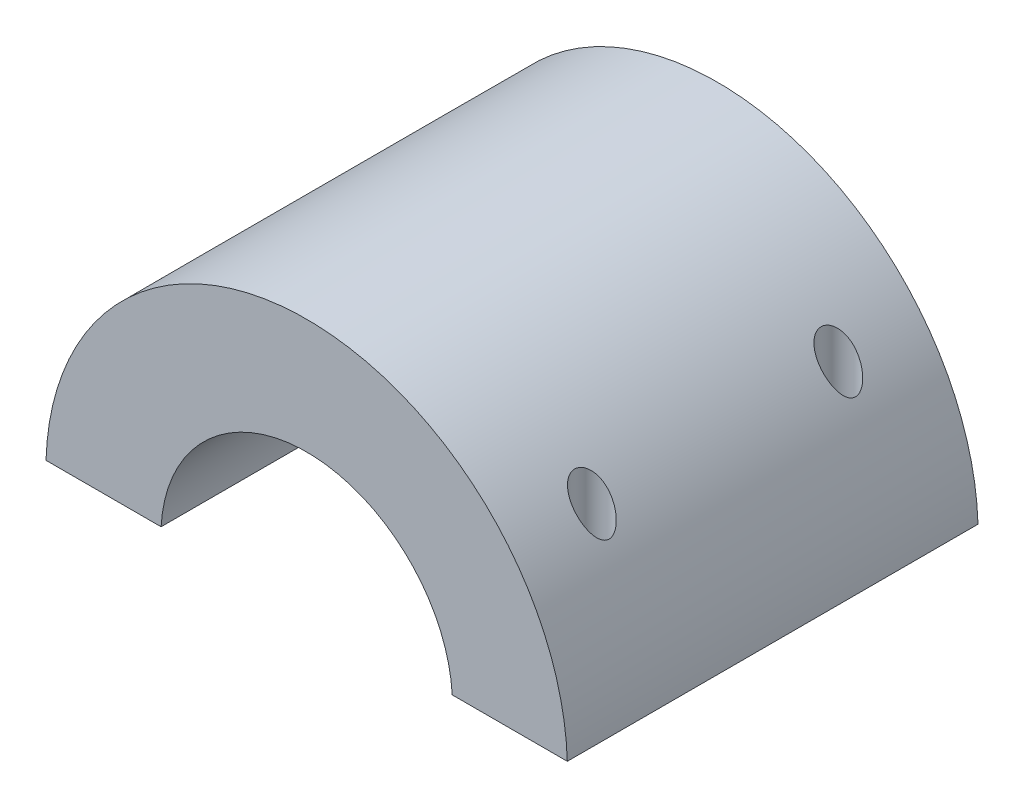
ISO-10303-21;
HEADER;
FILE_DESCRIPTION(('STEP AP214'),'2;1');
FILE_NAME('part.step','',(''),(''),'','','');
FILE_SCHEMA(('AUTOMOTIVE_DESIGN { 1 0 10303 214 1 1 1 1 }'));
ENDSEC;
DATA;
#1=APPLICATION_CONTEXT('core data for automotive mechanical design processes');
#2=APPLICATION_PROTOCOL_DEFINITION('international standard','automotive_design',2000,#1);
#3=PRODUCT_CONTEXT('',#1,'mechanical');
#4=PRODUCT('Part','Part','',(#3));
#5=PRODUCT_RELATED_PRODUCT_CATEGORY('part','',(#4));
#6=PRODUCT_DEFINITION_FORMATION('','',#4);
#7=PRODUCT_DEFINITION_CONTEXT('part definition',#1,'design');
#8=PRODUCT_DEFINITION('design','',#6,#7);
#9=PRODUCT_DEFINITION_SHAPE('','',#8);
#10=(LENGTH_UNIT() NAMED_UNIT(*) SI_UNIT(.MILLI.,.METRE.));
#11=(NAMED_UNIT(*) PLANE_ANGLE_UNIT() SI_UNIT($,.RADIAN.));
#12=(NAMED_UNIT(*) SI_UNIT($,.STERADIAN.) SOLID_ANGLE_UNIT());
#13=UNCERTAINTY_MEASURE_WITH_UNIT(LENGTH_MEASURE(1.E-05),#10,'distance_accuracy_value','');
#14=(GEOMETRIC_REPRESENTATION_CONTEXT(3) GLOBAL_UNCERTAINTY_ASSIGNED_CONTEXT((#13)) GLOBAL_UNIT_ASSIGNED_CONTEXT((#10,
#11,#12)) REPRESENTATION_CONTEXT('',''));
#15=CARTESIAN_POINT('',(0.,0.,0.));
#16=DIRECTION('',(0.,0.,1.));
#17=DIRECTION('',(1.,0.,0.));
#18=AXIS2_PLACEMENT_3D('',#15,#16,#17);
#19=CARTESIAN_POINT('',(0.,0.,50.));
#20=DIRECTION('',(0.,0.,-1.));
#21=DIRECTION('',(-1.,0.,0.));
#22=AXIS2_PLACEMENT_3D('',#19,#20,#21);
#23=CYLINDRICAL_SURFACE('',#22,31.75);
#24=CARTESIAN_POINT('',(-24.7280283297466,19.9144950958654,37.9));
#25=CARTESIAN_POINT('',(-24.6428554988149,20.0202557515295,37.9000019193602));
#26=CARTESIAN_POINT('',(-24.557008965641,20.1254602188119,37.9051723099552));
#27=CARTESIAN_POINT('',(-24.3844723968006,20.3341665965845,37.9264692281959));
#28=CARTESIAN_POINT('',(-24.2977820238086,20.4376677776256,37.9426003309251));
#29=CARTESIAN_POINT('',(-24.1244605621036,20.6419673595394,37.9866222893193));
#30=CARTESIAN_POINT('',(-24.0378295689512,20.7427694525141,38.0144961052082));
#31=CARTESIAN_POINT('',(-23.8655769347329,20.9407242274326,38.0830332029018));
#32=CARTESIAN_POINT('',(-23.7799544855246,21.037879990178,38.1236854028697));
#33=CARTESIAN_POINT('',(-23.6030507159638,21.2362368747943,38.2235700029081));
#34=CARTESIAN_POINT('',(-23.5119977842424,21.3369546688765,38.2841936646951));
#35=CARTESIAN_POINT('',(-23.335427850559,21.5299172903328,38.4241434967715));
#36=CARTESIAN_POINT('',(-23.2499033152815,21.6221737227063,38.5034435023705));
#37=CARTESIAN_POINT('',(-23.104938854677,21.776895077098,38.6640519446132));
#38=CARTESIAN_POINT('',(-23.0437481006753,21.8415880808563,38.7416070621418));
#39=CARTESIAN_POINT('',(-22.9302085850994,21.9607555403227,38.9099935111327));
#40=CARTESIAN_POINT('',(-22.8778479577153,22.0152437202112,39.0008067151943));
#41=CARTESIAN_POINT('',(-22.7952391219599,22.1007318385835,39.1744588480943));
#42=CARTESIAN_POINT('',(-22.7626563394566,22.1342620171961,39.2549316442756));
#43=CARTESIAN_POINT('',(-22.7070676415742,22.1912859329778,39.4225133285041));
#44=CARTESIAN_POINT('',(-22.6840555481272,22.2147861449453,39.5096178925122));
#45=CARTESIAN_POINT('',(-22.6491761242215,22.2503474585535,39.6889369469299));
#46=CARTESIAN_POINT('',(-22.6373796882606,22.2623357980016,39.781180091649));
#47=CARTESIAN_POINT('',(-22.6262218976126,22.2736762761457,39.9671843295311));
#48=CARTESIAN_POINT('',(-22.6268558571594,22.273033176393,40.0609448373916));
#49=CARTESIAN_POINT('',(-22.6397826602446,22.2598921942833,40.2371502586409));
#50=CARTESIAN_POINT('',(-22.6508882404772,22.2486015087383,40.3197794875201));
#51=CARTESIAN_POINT('',(-22.6822830231849,22.2165936802652,40.4813547170553));
#52=CARTESIAN_POINT('',(-22.7025731787321,22.1958755590628,40.5603003345294));
#53=CARTESIAN_POINT('',(-22.7520393018955,22.1451686891129,40.7158086867132));
#54=CARTESIAN_POINT('',(-22.7815249866583,22.1148561531806,40.7921653239098));
#55=CARTESIAN_POINT('',(-22.8475127996441,22.0466758708029,40.9381313435327));
#56=CARTESIAN_POINT('',(-22.8840186265449,22.0088041412707,41.0077371399558));
#57=CARTESIAN_POINT('',(-22.9832647784215,21.9052387081702,41.1745411139535));
#58=CARTESIAN_POINT('',(-23.0496992365125,21.835393710958,41.2669761678225));
#59=CARTESIAN_POINT('',(-23.1911058420834,21.6851525408156,41.4352742845386));
#60=CARTESIAN_POINT('',(-23.266098344869,21.6047311397013,41.5110965295361));
#61=CARTESIAN_POINT('',(-23.4553236981815,21.3994678020596,41.6769779128811));
#62=CARTESIAN_POINT('',(-23.5723792466759,21.2705761092943,41.7587707849483));
#63=CARTESIAN_POINT('',(-23.8111791497816,21.0029190650672,41.8942760331488));
#64=CARTESIAN_POINT('',(-23.9329304282464,20.8641388561027,41.9479450976505));
#65=CARTESIAN_POINT('',(-24.1422836071243,20.6211189870472,42.0187486850744));
#66=CARTESIAN_POINT('',(-24.2296708433654,20.5183809668015,42.0419458613788));
#67=CARTESIAN_POINT('',(-24.4041000502553,20.3106078604613,42.0767731292156));
#68=CARTESIAN_POINT('',(-24.4911418568187,20.2055718084444,42.0883982574038));
#69=CARTESIAN_POINT('',(-24.6643158750043,19.9938184267603,42.1008308256512));
#70=CARTESIAN_POINT('',(-24.7504460708589,19.8870983095189,42.1016179041554));
#71=CARTESIAN_POINT('',(-24.921091699947,19.6728351520505,42.0928508215475));
#72=CARTESIAN_POINT('',(-25.0056073924316,19.5652922478946,42.0832983351743));
#73=CARTESIAN_POINT('',(-25.1747836870916,19.3471525975669,42.053771239076));
#74=CARTESIAN_POINT('',(-25.2593898625408,19.236549788208,42.0335296447154));
#75=CARTESIAN_POINT('',(-25.4260159324306,19.0157656894158,41.9825257215204));
#76=CARTESIAN_POINT('',(-25.5080350949676,18.9055845268835,41.9517604440306));
#77=CARTESIAN_POINT('',(-25.6687564916281,18.6867817601804,41.8795671788701));
#78=CARTESIAN_POINT('',(-25.7474672489248,18.5781566931903,41.8381688290725));
#79=CARTESIAN_POINT('',(-25.9011673379522,18.3632637633046,41.7440933108115));
#80=CARTESIAN_POINT('',(-25.976159301034,18.2569942639688,41.6914242617087));
#81=CARTESIAN_POINT('',(-26.1205170834076,18.0498413692962,41.5746328904914));
#82=CARTESIAN_POINT('',(-26.1899520860279,17.9489000238142,41.5107007277078));
#83=CARTESIAN_POINT('',(-26.3232470552563,17.7528354518744,41.3692089690415));
#84=CARTESIAN_POINT('',(-26.3871072257952,17.6577120126321,41.2916498719535));
#85=CARTESIAN_POINT('',(-26.4965800965095,17.4929062465643,41.1356285204378));
#86=CARTESIAN_POINT('',(-26.5434316012945,17.4216825530964,41.0596912292399));
#87=CARTESIAN_POINT('',(-26.6297303554376,17.2894806044257,40.8955909389648));
#88=CARTESIAN_POINT('',(-26.6691957503534,17.2284772804401,40.8074588517448));
#89=CARTESIAN_POINT('',(-26.7254441194643,17.1410279776693,40.6515895516091));
#90=CARTESIAN_POINT('',(-26.7453229032444,17.1099738728752,40.5875808479502));
#91=CARTESIAN_POINT('',(-26.7793877278283,17.056608512029,40.4545587231015));
#92=CARTESIAN_POINT('',(-26.7935796384358,17.0342882417618,40.3855505495525));
#93=CARTESIAN_POINT('',(-26.8151647549225,17.0002901297496,40.2430867423418));
#94=CARTESIAN_POINT('',(-26.8224873620715,16.9887228113531,40.169593020583));
#95=CARTESIAN_POINT('',(-26.8292265068125,16.9780786117845,40.0213535704679));
#96=CARTESIAN_POINT('',(-26.8286487705361,16.9789926841589,39.9466087881162));
#97=CARTESIAN_POINT('',(-26.8202819112474,16.9922045646084,39.808650194318));
#98=CARTESIAN_POINT('',(-26.8134580739956,17.0029785575933,39.7452203563266));
#99=CARTESIAN_POINT('',(-26.7945304503923,17.0327903681731,39.6211695141527));
#100=CARTESIAN_POINT('',(-26.7824234350479,17.0518332395376,39.560550252854));
#101=CARTESIAN_POINT('',(-26.7478767474019,17.1059926942891,39.4190821017041));
#102=CARTESIAN_POINT('',(-26.7232365969373,17.1444975600091,39.3400793172437));
#103=CARTESIAN_POINT('',(-26.6673020363706,17.2313716570841,39.1902772705965));
#104=CARTESIAN_POINT('',(-26.6359918683185,17.2797642369489,39.1194980595573));
#105=CARTESIAN_POINT('',(-26.5751520332814,17.3731477688196,38.9991348213346));
#106=CARTESIAN_POINT('',(-26.5464980496618,17.4169139638338,38.9481294516009));
#107=CARTESIAN_POINT('',(-26.4866275094666,17.5078278883985,38.8508303202345));
#108=CARTESIAN_POINT('',(-26.4554093763629,17.5549776960275,38.8045394970385));
#109=CARTESIAN_POINT('',(-26.358512223855,17.7004192153919,38.6720134459615));
#110=CARTESIAN_POINT('',(-26.2896778062773,17.8025682705054,38.5922888794203));
#111=CARTESIAN_POINT('',(-26.1569668453881,17.9968703332075,38.4587064421331));
#112=CARTESIAN_POINT('',(-26.0939130150052,18.0882011951606,38.4027602912448));
#113=CARTESIAN_POINT('',(-25.9642825507963,18.2737882226707,38.3004423051816));
#114=CARTESIAN_POINT('',(-25.8977034806031,18.368046392248,38.2540772030984));
#115=CARTESIAN_POINT('',(-25.7616671805023,18.5583591042927,38.1702539907356));
#116=CARTESIAN_POINT('',(-25.6922105406027,18.6544132763189,38.1327940650761));
#117=CARTESIAN_POINT('',(-25.5508534500781,18.847565242713,38.066336981402));
#118=CARTESIAN_POINT('',(-25.4789538501433,18.9446626659064,38.0373369105332));
#119=CARTESIAN_POINT('',(-25.2970797456518,19.1873183025787,37.9752941595375));
#120=CARTESIAN_POINT('',(-25.1857869306761,19.3332006822458,37.9472900609486));
#121=CARTESIAN_POINT('',(-24.9594260049616,19.6245664464409,37.9096357632991));
#122=CARTESIAN_POINT('',(-24.8443555124835,19.7700495140617,37.8999973785799));
#123=CARTESIAN_POINT('',(-24.7280283297466,19.9144950958654,37.9));
#124=B_SPLINE_CURVE_WITH_KNOTS('',3,(#24,#25,#26,#27,#28,#29,#30,#31,#32,#33,#34,#35,#36,#37,
#38,#39,#40,#41,#42,#43,#44,#45,#46,#47,#48,#49,#50,#51,#52,#53,#54,#55,#56,#57,#58,#59,#60,#61,
#62,#63,#64,#65,#66,#67,#68,#69,#70,#71,#72,#73,#74,#75,#76,#77,#78,#79,#80,#81,#82,#83,#84,#85,
#86,#87,#88,#89,#90,#91,#92,#93,#94,#95,#96,#97,#98,#99,#100,#101,#102,#103,#104,#105,#106,#107,
#108,#109,#110,#111,#112,#113,#114,#115,#116,#117,#118,#119,#120,#121,#122,#123),.UNSPECIFIED.,
.T.,.F.,(4,2,2,2,2,2,2,2,2,2,2,2,2,2,2,2,2,2,2,2,2,2,2,2,2,2,2,2,2,2,2,2,2,2,2,2,2,2,2,2,2,2,2,
2,2,2,2,2,2,4),(0.,0.407246596628123,0.814663285546323,1.22149080007744,1.62796646924283,
2.07279693971113,2.51700789194793,2.87003975606011,3.22259337357175,3.50069304336051,
3.77861291465773,4.05827806990374,4.337837804509,4.58908494807764,4.84035816923152,
5.10122616829726,5.36223198841303,5.76063240652758,6.16000098661438,6.73395571959151,
7.3087917840091,7.71885919733602,8.1291024161764,8.54011625822715,8.95106353675497,
9.37279760794447,9.79464994271636,10.2153389606195,10.6357259302304,11.0495975488097,
11.463454021357,11.8050087185405,12.1457129709323,12.366590931826,12.5872403188368,
12.8101333380588,13.0328648140428,13.2260954347111,13.4194443205825,13.6917381706093,
13.9646825953362,14.1835650383086,14.4025830799051,14.8413006952128,15.2137204733246,
15.5864010863791,15.9590056607126,16.3314817898938,16.8873328028758,17.4435412645025),.UNSPECIFIED.);
#125=CARTESIAN_POINT('',(-24.7280283297466,19.9144950958654,37.9));
#126=VERTEX_POINT('',#125);
#127=EDGE_CURVE('E164',#126,#126,#124,.T.);
#128=ORIENTED_EDGE('',*,*,#127,.T.);
#129=EDGE_LOOP('',(#128));
#130=FACE_BOUND('',#129,.T.);
#131=CARTESIAN_POINT('',(-24.7280283297466,19.9144950958654,7.90000000000001));
#132=CARTESIAN_POINT('',(-24.6428554988149,20.0202557515295,7.90000191936025));
#133=CARTESIAN_POINT('',(-24.557008965641,20.1254602188119,7.90517230995521));
#134=CARTESIAN_POINT('',(-24.3844723968006,20.3341665965846,7.92646922819594));
#135=CARTESIAN_POINT('',(-24.2977820238086,20.4376677776256,7.94260033092508));
#136=CARTESIAN_POINT('',(-24.1244605621036,20.6419673595394,7.98662228931932));
#137=CARTESIAN_POINT('',(-24.0378295689512,20.7427694525141,8.01449610520817));
#138=CARTESIAN_POINT('',(-23.8655769347329,20.9407242274326,8.08303320290177));
#139=CARTESIAN_POINT('',(-23.7799544855246,21.037879990178,8.12368540286966));
#140=CARTESIAN_POINT('',(-23.6030507159638,21.2362368747944,8.22357000290813));
#141=CARTESIAN_POINT('',(-23.5119977842424,21.3369546688765,8.28419366469511));
#142=CARTESIAN_POINT('',(-23.335427850559,21.5299172903328,8.42414349677148));
#143=CARTESIAN_POINT('',(-23.2499033152815,21.6221737227063,8.50344350237054));
#144=CARTESIAN_POINT('',(-23.104938854677,21.776895077098,8.66405194461318));
#145=CARTESIAN_POINT('',(-23.0437481006753,21.8415880808563,8.74160706214181));
#146=CARTESIAN_POINT('',(-22.9302085850994,21.9607555403227,8.90999351113272));
#147=CARTESIAN_POINT('',(-22.8778479577153,22.0152437202112,9.00080671519433));
#148=CARTESIAN_POINT('',(-22.7952391219599,22.1007318385835,9.17445884809427));
#149=CARTESIAN_POINT('',(-22.7626563394566,22.1342620171961,9.25493164427563));
#150=CARTESIAN_POINT('',(-22.7070676415742,22.1912859329778,9.42251332850407));
#151=CARTESIAN_POINT('',(-22.6840555481272,22.2147861449453,9.50961789251218));
#152=CARTESIAN_POINT('',(-22.6491761242215,22.2503474585535,9.68893694692987));
#153=CARTESIAN_POINT('',(-22.6373796882606,22.2623357980016,9.78118009164905));
#154=CARTESIAN_POINT('',(-22.6262218976126,22.2736762761457,9.96718432953114));
#155=CARTESIAN_POINT('',(-22.6268558571594,22.273033176393,10.0609448373916));
#156=CARTESIAN_POINT('',(-22.6397826602446,22.2598921942833,10.2371502586409));
#157=CARTESIAN_POINT('',(-22.6508882404772,22.2486015087383,10.3197794875201));
#158=CARTESIAN_POINT('',(-22.6822830231849,22.2165936802653,10.4813547170553));
#159=CARTESIAN_POINT('',(-22.7025731787321,22.1958755590628,10.5603003345294));
#160=CARTESIAN_POINT('',(-22.7520393018955,22.1451686891129,10.7158086867132));
#161=CARTESIAN_POINT('',(-22.7815249866583,22.1148561531806,10.7921653239098));
#162=CARTESIAN_POINT('',(-22.8475127996441,22.0466758708029,10.9381313435327));
#163=CARTESIAN_POINT('',(-22.8840186265449,22.0088041412707,11.0077371399558));
#164=CARTESIAN_POINT('',(-22.9832647784215,21.9052387081702,11.1745411139535));
#165=CARTESIAN_POINT('',(-23.0496992365125,21.835393710958,11.2669761678225));
#166=CARTESIAN_POINT('',(-23.1911058420834,21.6851525408156,11.4352742845386));
#167=CARTESIAN_POINT('',(-23.266098344869,21.6047311397013,11.5110965295361));
#168=CARTESIAN_POINT('',(-23.4553236981815,21.3994678020596,11.6769779128811));
#169=CARTESIAN_POINT('',(-23.5723792466759,21.2705761092943,11.7587707849483));
#170=CARTESIAN_POINT('',(-23.8111791497816,21.0029190650672,11.8942760331488));
#171=CARTESIAN_POINT('',(-23.9329304282464,20.8641388561027,11.9479450976505));
#172=CARTESIAN_POINT('',(-24.1422836071243,20.6211189870472,12.0187486850744));
#173=CARTESIAN_POINT('',(-24.2296708433654,20.5183809668015,12.0419458613788));
#174=CARTESIAN_POINT('',(-24.4041000502553,20.3106078604613,12.0767731292156));
#175=CARTESIAN_POINT('',(-24.4911418568187,20.2055718084444,12.0883982574038));
#176=CARTESIAN_POINT('',(-24.6643158750043,19.9938184267603,12.1008308256511));
#177=CARTESIAN_POINT('',(-24.7504460708589,19.8870983095189,12.1016179041554));
#178=CARTESIAN_POINT('',(-24.921091699947,19.6728351520505,12.0928508215475));
#179=CARTESIAN_POINT('',(-25.0056073924316,19.5652922478946,12.0832983351743));
#180=CARTESIAN_POINT('',(-25.1747836870916,19.3471525975669,12.053771239076));
#181=CARTESIAN_POINT('',(-25.2593898625408,19.236549788208,12.0335296447154));
#182=CARTESIAN_POINT('',(-25.4260159324306,19.0157656894158,11.9825257215204));
#183=CARTESIAN_POINT('',(-25.5080350949676,18.9055845268835,11.9517604440306));
#184=CARTESIAN_POINT('',(-25.6687564916281,18.6867817601804,11.8795671788701));
#185=CARTESIAN_POINT('',(-25.7474672489248,18.5781566931903,11.8381688290725));
#186=CARTESIAN_POINT('',(-25.9011673379522,18.3632637633046,11.7440933108115));
#187=CARTESIAN_POINT('',(-25.9761593010339,18.2569942639688,11.6914242617087));
#188=CARTESIAN_POINT('',(-26.1205170834076,18.0498413692962,11.5746328904915));
#189=CARTESIAN_POINT('',(-26.1899520860279,17.9489000238142,11.5107007277078));
#190=CARTESIAN_POINT('',(-26.3232470552563,17.7528354518744,11.3692089690415));
#191=CARTESIAN_POINT('',(-26.3871072257952,17.6577120126321,11.2916498719535));
#192=CARTESIAN_POINT('',(-26.4965800965095,17.4929062465643,11.1356285204378));
#193=CARTESIAN_POINT('',(-26.5434316012945,17.4216825530964,11.0596912292399));
#194=CARTESIAN_POINT('',(-26.6297303554376,17.2894806044256,10.8955909389648));
#195=CARTESIAN_POINT('',(-26.6691957503534,17.2284772804401,10.8074588517448));
#196=CARTESIAN_POINT('',(-26.7254441194643,17.1410279776693,10.6515895516091));
#197=CARTESIAN_POINT('',(-26.7453229032444,17.1099738728752,10.5875808479502));
#198=CARTESIAN_POINT('',(-26.7793877278283,17.056608512029,10.4545587231015));
#199=CARTESIAN_POINT('',(-26.7935796384358,17.0342882417618,10.3855505495525));
#200=CARTESIAN_POINT('',(-26.8151647549225,17.0002901297496,10.2430867423418));
#201=CARTESIAN_POINT('',(-26.8224873620715,16.9887228113531,10.169593020583));
#202=CARTESIAN_POINT('',(-26.8292265068125,16.9780786117845,10.0213535704679));
#203=CARTESIAN_POINT('',(-26.8286487705361,16.9789926841589,9.94660878811616));
#204=CARTESIAN_POINT('',(-26.8202819112474,16.9922045646084,9.808650194318));
#205=CARTESIAN_POINT('',(-26.8134580739956,17.0029785575933,9.74522035632665));
#206=CARTESIAN_POINT('',(-26.7945304503923,17.0327903681731,9.62116951415267));
#207=CARTESIAN_POINT('',(-26.7824234350479,17.0518332395376,9.56055025285404));
#208=CARTESIAN_POINT('',(-26.7478767474019,17.1059926942891,9.41908210170408));
#209=CARTESIAN_POINT('',(-26.7232365969373,17.1444975600091,9.34007931724373));
#210=CARTESIAN_POINT('',(-26.6673020363706,17.2313716570841,9.19027727059649));
#211=CARTESIAN_POINT('',(-26.6359918683185,17.2797642369489,9.11949805955727));
#212=CARTESIAN_POINT('',(-26.5751520332814,17.3731477688196,8.99913482133456));
#213=CARTESIAN_POINT('',(-26.5464980496618,17.4169139638338,8.94812945160093));
#214=CARTESIAN_POINT('',(-26.4866275094666,17.5078278883985,8.85083032023448));
#215=CARTESIAN_POINT('',(-26.4554093763629,17.5549776960275,8.80453949703847));
#216=CARTESIAN_POINT('',(-26.358512223855,17.7004192153919,8.67201344596154));
#217=CARTESIAN_POINT('',(-26.2896778062773,17.8025682705054,8.5922888794203));
#218=CARTESIAN_POINT('',(-26.1569668453881,17.9968703332074,8.45870644213312));
#219=CARTESIAN_POINT('',(-26.0939130150052,18.0882011951606,8.4027602912448));
#220=CARTESIAN_POINT('',(-25.9642825507963,18.2737882226707,8.30044230518158));
#221=CARTESIAN_POINT('',(-25.8977034806031,18.3680463922479,8.25407720309838));
#222=CARTESIAN_POINT('',(-25.7616671805023,18.5583591042926,8.17025399073564));
#223=CARTESIAN_POINT('',(-25.6922105406027,18.6544132763189,8.13279406507607));
#224=CARTESIAN_POINT('',(-25.5508534500781,18.847565242713,8.06633698140199));
#225=CARTESIAN_POINT('',(-25.4789538501434,18.9446626659064,8.03733691053318));
#226=CARTESIAN_POINT('',(-25.2970797456518,19.1873183025787,7.9752941595375));
#227=CARTESIAN_POINT('',(-25.1857869306761,19.3332006822458,7.94729006094856));
#228=CARTESIAN_POINT('',(-24.9594260049616,19.6245664464409,7.90963576329909));
#229=CARTESIAN_POINT('',(-24.8443555124835,19.7700495140617,7.89999737857992));
#230=CARTESIAN_POINT('',(-24.7280283297466,19.9144950958654,7.90000000000001));
#231=B_SPLINE_CURVE_WITH_KNOTS('',3,(#131,#132,#133,#134,#135,#136,#137,#138,#139,#140,#141,
#142,#143,#144,#145,#146,#147,#148,#149,#150,#151,#152,#153,#154,#155,#156,#157,#158,#159,#160,
#161,#162,#163,#164,#165,#166,#167,#168,#169,#170,#171,#172,#173,#174,#175,#176,#177,#178,#179,
#180,#181,#182,#183,#184,#185,#186,#187,#188,#189,#190,#191,#192,#193,#194,#195,#196,#197,#198,
#199,#200,#201,#202,#203,#204,#205,#206,#207,#208,#209,#210,#211,#212,#213,#214,#215,#216,#217,
#218,#219,#220,#221,#222,#223,#224,#225,#226,#227,#228,#229,#230),.UNSPECIFIED.,.T.,.F.,(4,2,2,
2,2,2,2,2,2,2,2,2,2,2,2,2,2,2,2,2,2,2,2,2,2,2,2,2,2,2,2,2,2,2,2,2,2,2,2,2,2,2,2,2,2,2,2,2,2,4),
(0.,0.407246596628126,0.814663285546325,1.22149080007745,1.62796646924283,2.07279693971112,
2.51700789194792,2.87003975606011,3.22259337357175,3.50069304336051,3.77861291465773,
4.05827806990376,4.33783780450901,4.58908494807764,4.84035816923153,5.10122616829727,
5.36223198841304,5.76063240652758,6.16000098661437,6.73395571959151,7.3087917840091,
7.71885919733602,8.1291024161764,8.54011625822714,8.95106353675497,9.37279760794446,
9.79464994271635,10.2153389606195,10.6357259302304,11.0495975488097,11.463454021357,
11.8050087185406,12.1457129709323,12.366590931826,12.5872403188368,12.8101333380588,
13.0328648140428,13.2260954347111,13.4194443205825,13.6917381706093,13.9646825953362,
14.1835650383086,14.4025830799051,14.8413006952128,15.2137204733246,15.5864010863791,
15.9590056607126,16.3314817898938,16.8873328028758,17.4435412645026),.UNSPECIFIED.);
#232=CARTESIAN_POINT('',(-24.7280283297466,19.9144950958654,7.90000000000001));
#233=VERTEX_POINT('',#232);
#234=EDGE_CURVE('E145',#233,#233,#231,.T.);
#235=ORIENTED_EDGE('',*,*,#234,.T.);
#236=EDGE_LOOP('',(#235));
#237=FACE_BOUND('',#236,.T.);
#238=CARTESIAN_POINT('',(24.7280283297466,19.9144950958654,37.9));
#239=CARTESIAN_POINT('',(24.8238481285202,19.7955156519236,37.9000020966215));
#240=CARTESIAN_POINT('',(24.9187864613373,19.6758673592113,37.90654289352));
#241=CARTESIAN_POINT('',(25.1063356494559,19.4359870815876,37.9321875265085));
#242=CARTESIAN_POINT('',(25.1989452368265,19.3157548194812,37.9512980589821));
#243=CARTESIAN_POINT('',(25.3812275979881,19.0755998843801,38.0019300390078));
#244=CARTESIAN_POINT('',(25.4708993692297,18.9556773296747,38.0334556764809));
#245=CARTESIAN_POINT('',(25.6465939428124,18.7172821701762,38.1091322043946));
#246=CARTESIAN_POINT('',(25.7326190105552,18.5988086987254,38.1532751207413));
#247=CARTESIAN_POINT('',(25.9141742396761,18.3451931893672,38.2632989437302));
#248=CARTESIAN_POINT('',(26.0089474549925,18.2105064018919,38.3315584077479));
#249=CARTESIAN_POINT('',(26.14525210073,18.0137363176988,38.449175863811));
#250=CARTESIAN_POINT('',(26.1896902719248,17.9490541351349,38.490894960391));
#251=CARTESIAN_POINT('',(26.2762896393842,17.8220368736102,38.5798795415026));
#252=CARTESIAN_POINT('',(26.3184516274389,17.7597009807869,38.6271430789615));
#253=CARTESIAN_POINT('',(26.4137150247483,17.6178228001425,38.7446287363201));
#254=CARTESIAN_POINT('',(26.4657522354873,17.5395081500462,38.8172392008564));
#255=CARTESIAN_POINT('',(26.5631652523676,17.3916228107032,38.9748963226272));
#256=CARTESIAN_POINT('',(26.6085514185156,17.3220385474148,39.0599232178469));
#257=CARTESIAN_POINT('',(26.67691442877,17.2164856764859,39.2147830055472));
#258=CARTESIAN_POINT('',(26.7024442588824,17.1768367809802,39.280949684006));
#259=CARTESIAN_POINT('',(26.74758862232,17.1064533908265,39.4197605070659));
#260=CARTESIAN_POINT('',(26.7672126965525,17.0757045210535,39.4923939556934));
#261=CARTESIAN_POINT('',(26.7960624321005,17.0303885097551,39.6295682476036));
#262=CARTESIAN_POINT('',(26.8065252488433,17.0139029867742,39.6932055802882));
#263=CARTESIAN_POINT('',(26.8215583127947,16.990194613202,39.8228610051128));
#264=CARTESIAN_POINT('',(26.8261337036509,16.9829636772163,39.8888769672071));
#265=CARTESIAN_POINT('',(26.8289679227178,16.9784860779909,40.0215608619936));
#266=CARTESIAN_POINT('',(26.8272107882977,16.9812646460713,40.0882300192211));
#267=CARTESIAN_POINT('',(26.8175216775546,16.9965616357497,40.2199825778589));
#268=CARTESIAN_POINT('',(26.8095854270509,17.0090867992005,40.2850648494485));
#269=CARTESIAN_POINT('',(26.7860859899964,17.0460746029359,40.4246924654151));
#270=CARTESIAN_POINT('',(26.7693149344626,17.0724236259294,40.4985273872943));
#271=CARTESIAN_POINT('',(26.7294439710075,17.1347802290189,40.6401379030745));
#272=CARTESIAN_POINT('',(26.7063326102656,17.1708052849426,40.7079022346631));
#273=CARTESIAN_POINT('',(26.642336216677,17.2700144795792,40.8696946041683));
#274=CARTESIAN_POINT('',(26.5983708990682,17.3377242715365,40.9596932787796));
#275=CARTESIAN_POINT('',(26.5029336455195,17.4832673267508,41.1264917552946));
#276=CARTESIAN_POINT('',(26.4514436641448,17.5611248761252,41.2032588328937));
#277=CARTESIAN_POINT('',(26.3509002615777,17.7115652052904,41.3349557599344));
#278=CARTESIAN_POINT('',(26.3025643793986,17.7832921188352,41.3914383123538));
#279=CARTESIAN_POINT('',(26.2027259514611,17.9300735484285,41.4968438808927));
#280=CARTESIAN_POINT('',(26.151221259936,18.0051303094814,41.5457616939938));
#281=CARTESIAN_POINT('',(26.0455411250356,18.1576682072762,41.6367737938285));
#282=CARTESIAN_POINT('',(25.9913613446681,18.2351532012118,41.678856491573));
#283=CARTESIAN_POINT('',(25.8807881828678,18.3917508912574,41.7566194948609));
#284=CARTESIAN_POINT('',(25.8243941980906,18.470864028183,41.7922980403851));
#285=CARTESIAN_POINT('',(25.683592724402,18.6664388044963,41.8724650832997));
#286=CARTESIAN_POINT('',(25.598111140945,18.7835199485421,41.9135787171914));
#287=CARTESIAN_POINT('',(25.4237592116958,19.0188443391826,41.983628934212));
#288=CARTESIAN_POINT('',(25.3348872730033,19.1370881121618,42.0125597146393));
#289=CARTESIAN_POINT('',(25.1543483077976,19.3737816581557,42.0583789137951));
#290=CARTESIAN_POINT('',(25.0626811732915,19.4922314389626,42.0752668666301));
#291=CARTESIAN_POINT('',(24.8771465740789,19.7284723355935,42.0967788589454));
#292=CARTESIAN_POINT('',(24.7832799120953,19.846263672863,42.1014073043468));
#293=CARTESIAN_POINT('',(24.6126277465108,20.0573098531843,42.098203556996));
#294=CARTESIAN_POINT('',(24.5361200101985,20.150827148851,42.0926464227325));
#295=CARTESIAN_POINT('',(24.3825074275094,20.3364287425242,42.0728271195654));
#296=CARTESIAN_POINT('',(24.3054027051249,20.428513326745,42.0585667128286));
#297=CARTESIAN_POINT('',(24.1512289155696,20.6105516242319,42.0207898061269));
#298=CARTESIAN_POINT('',(24.0741600073544,20.7005086675166,41.997288948022));
#299=CARTESIAN_POINT('',(23.9206513872055,20.87770773478,41.9403197524804));
#300=CARTESIAN_POINT('',(23.8442114066616,20.9649509673749,41.9068559244101));
#301=CARTESIAN_POINT('',(23.6690444612182,21.1627331629345,41.8168848699374));
#302=CARTESIAN_POINT('',(23.5708444509762,21.2719993684501,41.7564423395926));
#303=CARTESIAN_POINT('',(23.3800292481708,21.4815438658487,41.6146195700599));
#304=CARTESIAN_POINT('',(23.2874071851634,21.581833291853,41.5332657667613));
#305=CARTESIAN_POINT('',(23.1340967265171,21.7459286072033,41.3706107783884));
#306=CARTESIAN_POINT('',(23.0711935684493,21.812606483905,41.2943235421002));
#307=CARTESIAN_POINT('',(22.9539348962717,21.9359654914854,41.128223014147));
#308=CARTESIAN_POINT('',(22.899567186082,21.9926609004018,41.0384293876144));
#309=CARTESIAN_POINT('',(22.8129313459789,22.0824757614373,40.8658479617641));
#310=CARTESIAN_POINT('',(22.7784184394896,22.1180461345113,40.7854737111589));
#311=CARTESIAN_POINT('',(22.7189387575113,22.1791376143684,40.6176294878786));
#312=CARTESIAN_POINT('',(22.6939662982842,22.204664704726,40.5301637777246));
#313=CARTESIAN_POINT('',(22.6552529294364,22.2441633532277,40.3495444551249));
#314=CARTESIAN_POINT('',(22.6415901871557,22.2580544970231,40.2563559615973));
#315=CARTESIAN_POINT('',(22.6270076768351,22.272879104423,40.0679723457324));
#316=CARTESIAN_POINT('',(22.6260815626707,22.2738190210782,39.9727782463866));
#317=CARTESIAN_POINT('',(22.6364160306782,22.2633151118199,39.7944803557384));
#318=CARTESIAN_POINT('',(22.646331910798,22.2532377449068,39.7112099925877));
#319=CARTESIAN_POINT('',(22.6755465293715,22.2234677836667,39.5481345871848));
#320=CARTESIAN_POINT('',(22.6948460939537,22.2037743427512,39.4683298507163));
#321=CARTESIAN_POINT('',(22.7422665244593,22.1552021673282,39.3117955798196));
#322=CARTESIAN_POINT('',(22.770613559584,22.1260876320234,39.2352092192262));
#323=CARTESIAN_POINT('',(22.8344176074479,22.0602352774659,39.0886038377264));
#324=CARTESIAN_POINT('',(22.8698780093543,22.0234938240727,39.0185879707645));
#325=CARTESIAN_POINT('',(22.9660372040497,21.9232880045709,38.8515973133409));
#326=CARTESIAN_POINT('',(23.0303706917645,21.8557648199394,38.7591399334027));
#327=CARTESIAN_POINT('',(23.167679703323,21.7101638405601,38.5903138154881));
#328=CARTESIAN_POINT('',(23.2406765957223,21.6320598780159,38.5139862063748));
#329=CARTESIAN_POINT('',(23.424943199068,21.4326840145664,38.3466770593748));
#330=CARTESIAN_POINT('',(23.5390834590453,21.3073792067744,38.2636928309391));
#331=CARTESIAN_POINT('',(23.7722715539068,21.0469085013949,38.1251778566755));
#332=CARTESIAN_POINT('',(23.8913241741116,20.911732884687,38.069674599424));
#333=CARTESIAN_POINT('',(24.1307151325455,20.6350328238825,37.9827192625055));
#334=CARTESIAN_POINT('',(24.2510538920226,20.4935062478912,37.9512753239989));
#335=CARTESIAN_POINT('',(24.4907170738964,20.2064908422626,37.9099089083023));
#336=CARTESIAN_POINT('',(24.6100409475177,20.0610000281387,37.8999974183323));
#337=CARTESIAN_POINT('',(24.7280283297466,19.9144950958654,37.9));
#338=B_SPLINE_CURVE_WITH_KNOTS('',3,(#238,#239,#240,#241,#242,#243,#244,#245,#246,#247,#248,
#249,#250,#251,#252,#253,#254,#255,#256,#257,#258,#259,#260,#261,#262,#263,#264,#265,#266,#267,
#268,#269,#270,#271,#272,#273,#274,#275,#276,#277,#278,#279,#280,#281,#282,#283,#284,#285,#286,
#287,#288,#289,#290,#291,#292,#293,#294,#295,#296,#297,#298,#299,#300,#301,#302,#303,#304,#305,
#306,#307,#308,#309,#310,#311,#312,#313,#314,#315,#316,#317,#318,#319,#320,#321,#322,#323,#324,
#325,#326,#327,#328,#329,#330,#331,#332,#333,#334,#335,#336,#337),.UNSPECIFIED.,.T.,.F.,(4,2,2,
2,2,2,2,2,2,2,2,2,2,2,2,2,2,2,2,2,2,2,2,2,2,2,2,2,2,2,2,2,2,2,2,2,2,2,2,2,2,2,2,2,2,2,2,2,2,4),
(0.,0.458113007808894,0.916470267998546,1.37498234998297,1.83320529160681,2.3666270027706,
2.63307039866369,2.89942050465646,3.25495595598344,3.60993158237297,3.85294634092116,
4.09556636862063,4.29442280644308,4.49310539180331,4.69228915361971,4.89161081616197,
5.13079375791996,5.3704116257531,5.73109862112342,6.0926652494803,6.40214564831117,
6.71183796960349,7.0220500155382,7.33234718530378,7.78379074531088,8.23544908565163,
8.68712489807533,9.13863836154623,9.50120629976985,9.86370085256961,10.2255844129166,
10.5873044285402,11.0624410321412,11.5369799004349,11.8935577432242,12.2496213506544,
12.5317890400311,12.8137883643989,13.0977208327755,13.381511824451,13.6337217308067,
13.8859538454464,14.1450631769718,14.4042962557442,14.796060233682,15.18881141765,
15.7518669720812,16.3154846057568,16.8792928713768,17.443388760204),.UNSPECIFIED.);
#339=CARTESIAN_POINT('',(24.7280283297466,19.9144950958654,37.9));
#340=VERTEX_POINT('',#339);
#341=EDGE_CURVE('E136',#340,#340,#338,.T.);
#342=ORIENTED_EDGE('',*,*,#341,.T.);
#343=EDGE_LOOP('',(#342));
#344=FACE_BOUND('',#343,.T.);
#345=CARTESIAN_POINT('',(24.7280283297466,19.9144950958654,7.90000000000006));
#346=CARTESIAN_POINT('',(24.8238481285202,19.7955156519236,7.90000209662154));
#347=CARTESIAN_POINT('',(24.9187864613373,19.6758673592113,7.90654289352007));
#348=CARTESIAN_POINT('',(25.1063356494559,19.4359870815876,7.9321875265086));
#349=CARTESIAN_POINT('',(25.1989452368265,19.3157548194812,7.9512980589822));
#350=CARTESIAN_POINT('',(25.3812275979881,19.0755998843801,8.00193003900782));
#351=CARTESIAN_POINT('',(25.4708993692297,18.9556773296747,8.03345567648096));
#352=CARTESIAN_POINT('',(25.6465939428124,18.7172821701762,8.10913220439466));
#353=CARTESIAN_POINT('',(25.7326190105552,18.5988086987254,8.15327512074137));
#354=CARTESIAN_POINT('',(25.9141742396761,18.3451931893672,8.26329894373024));
#355=CARTESIAN_POINT('',(26.0089474549925,18.2105064018919,8.33155840774799));
#356=CARTESIAN_POINT('',(26.14525210073,18.0137363176988,8.44917586381101));
#357=CARTESIAN_POINT('',(26.1896902719248,17.9490541351349,8.49089496039102));
#358=CARTESIAN_POINT('',(26.2762896393842,17.8220368736102,8.57987954150266));
#359=CARTESIAN_POINT('',(26.3184516274389,17.7597009807869,8.62714307896154));
#360=CARTESIAN_POINT('',(26.4137150247482,17.6178228001425,8.74462873632014));
#361=CARTESIAN_POINT('',(26.4657522354873,17.5395081500462,8.81723920085649));
#362=CARTESIAN_POINT('',(26.5631652523676,17.3916228107032,8.97489632262724));
#363=CARTESIAN_POINT('',(26.6085514185156,17.3220385474148,9.05992321784693));
#364=CARTESIAN_POINT('',(26.67691442877,17.2164856764859,9.21478300554722));
#365=CARTESIAN_POINT('',(26.7024442588824,17.1768367809802,9.2809496840061));
#366=CARTESIAN_POINT('',(26.74758862232,17.1064533908265,9.41976050706599));
#367=CARTESIAN_POINT('',(26.7672126965525,17.0757045210535,9.49239395569343));
#368=CARTESIAN_POINT('',(26.7960624321005,17.0303885097551,9.62956824760364));
#369=CARTESIAN_POINT('',(26.8065252488433,17.0139029867742,9.69320558028823));
#370=CARTESIAN_POINT('',(26.8215583127947,16.990194613202,9.82286100511282));
#371=CARTESIAN_POINT('',(26.8261337036509,16.9829636772163,9.88887696720718));
#372=CARTESIAN_POINT('',(26.8289679227178,16.9784860779909,10.0215608619937));
#373=CARTESIAN_POINT('',(26.8272107882977,16.9812646460713,10.0882300192211));
#374=CARTESIAN_POINT('',(26.8175216775546,16.9965616357497,10.219982577859));
#375=CARTESIAN_POINT('',(26.8095854270509,17.0090867992005,10.2850648494486));
#376=CARTESIAN_POINT('',(26.7860859899964,17.0460746029359,10.4246924654151));
#377=CARTESIAN_POINT('',(26.7693149344626,17.0724236259294,10.4985273872944));
#378=CARTESIAN_POINT('',(26.7294439710075,17.1347802290189,10.6401379030745));
#379=CARTESIAN_POINT('',(26.7063326102656,17.1708052849426,10.7079022346632));
#380=CARTESIAN_POINT('',(26.642336216677,17.2700144795792,10.8696946041683));
#381=CARTESIAN_POINT('',(26.5983708990682,17.3377242715365,10.9596932787797));
#382=CARTESIAN_POINT('',(26.5029336455195,17.4832673267509,11.1264917552947));
#383=CARTESIAN_POINT('',(26.4514436641448,17.5611248761252,11.2032588328938));
#384=CARTESIAN_POINT('',(26.3509002615777,17.7115652052905,11.3349557599345));
#385=CARTESIAN_POINT('',(26.3025643793986,17.7832921188352,11.3914383123539));
#386=CARTESIAN_POINT('',(26.2027259514611,17.9300735484285,11.4968438808927));
#387=CARTESIAN_POINT('',(26.151221259936,18.0051303094814,11.5457616939938));
#388=CARTESIAN_POINT('',(26.0455411250356,18.1576682072762,11.6367737938285));
#389=CARTESIAN_POINT('',(25.9913613446681,18.2351532012118,11.6788564915731));
#390=CARTESIAN_POINT('',(25.8807881828678,18.3917508912574,11.756619494861));
#391=CARTESIAN_POINT('',(25.8243941980906,18.470864028183,11.7922980403852));
#392=CARTESIAN_POINT('',(25.683592724402,18.6664388044963,11.8724650832998));
#393=CARTESIAN_POINT('',(25.598111140945,18.7835199485421,11.9135787171915));
#394=CARTESIAN_POINT('',(25.4237592116958,19.0188443391826,11.983628934212));
#395=CARTESIAN_POINT('',(25.3348872730033,19.1370881121618,12.0125597146393));
#396=CARTESIAN_POINT('',(25.1543483077976,19.3737816581558,12.0583789137951));
#397=CARTESIAN_POINT('',(25.0626811732915,19.4922314389626,12.0752668666302));
#398=CARTESIAN_POINT('',(24.8771465740789,19.7284723355935,12.0967788589455));
#399=CARTESIAN_POINT('',(24.7832799120952,19.8462636728631,12.1014073043468));
#400=CARTESIAN_POINT('',(24.6126277465108,20.0573098531843,12.098203556996));
#401=CARTESIAN_POINT('',(24.5361200101984,20.150827148851,12.0926464227325));
#402=CARTESIAN_POINT('',(24.3825074275093,20.3364287425243,12.0728271195654));
#403=CARTESIAN_POINT('',(24.3054027051248,20.428513326745,12.0585667128287));
#404=CARTESIAN_POINT('',(24.1512289155696,20.6105516242319,12.020789806127));
#405=CARTESIAN_POINT('',(24.0741600073544,20.7005086675167,11.9972889480221));
#406=CARTESIAN_POINT('',(23.9206513872055,20.87770773478,11.9403197524804));
#407=CARTESIAN_POINT('',(23.8442114066616,20.9649509673749,11.9068559244102));
#408=CARTESIAN_POINT('',(23.6690444612182,21.1627331629345,11.8168848699375));
#409=CARTESIAN_POINT('',(23.5708444509762,21.2719993684501,11.7564423395927));
#410=CARTESIAN_POINT('',(23.3800292481708,21.4815438658487,11.6146195700599));
#411=CARTESIAN_POINT('',(23.2874071851634,21.581833291853,11.5332657667613));
#412=CARTESIAN_POINT('',(23.134096726517,21.7459286072033,11.3706107783885));
#413=CARTESIAN_POINT('',(23.0711935684493,21.812606483905,11.2943235421003));
#414=CARTESIAN_POINT('',(22.9539348962717,21.9359654914854,11.128223014147));
#415=CARTESIAN_POINT('',(22.899567186082,21.9926609004018,11.0384293876144));
#416=CARTESIAN_POINT('',(22.8129313459789,22.0824757614373,10.8658479617641));
#417=CARTESIAN_POINT('',(22.7784184394896,22.1180461345113,10.785473711159));
#418=CARTESIAN_POINT('',(22.7189387575113,22.1791376143684,10.6176294878786));
#419=CARTESIAN_POINT('',(22.6939662982841,22.204664704726,10.5301637777246));
#420=CARTESIAN_POINT('',(22.6552529294364,22.2441633532277,10.3495444551249));
#421=CARTESIAN_POINT('',(22.6415901871557,22.2580544970231,10.2563559615973));
#422=CARTESIAN_POINT('',(22.6270076768351,22.272879104423,10.0679723457324));
#423=CARTESIAN_POINT('',(22.6260815626707,22.2738190210782,9.97277824638665));
#424=CARTESIAN_POINT('',(22.6364160306782,22.2633151118199,9.79448035573848));
#425=CARTESIAN_POINT('',(22.646331910798,22.2532377449068,9.71120999258771));
#426=CARTESIAN_POINT('',(22.6755465293715,22.2234677836666,9.5481345871848));
#427=CARTESIAN_POINT('',(22.6948460939538,22.2037743427512,9.46832985071634));
#428=CARTESIAN_POINT('',(22.7422665244593,22.1552021673282,9.31179557981963));
#429=CARTESIAN_POINT('',(22.770613559584,22.1260876320234,9.23520921922627));
#430=CARTESIAN_POINT('',(22.834417607448,22.0602352774659,9.08860383772643));
#431=CARTESIAN_POINT('',(22.8698780093543,22.0234938240727,9.01858797076451));
#432=CARTESIAN_POINT('',(22.9660372040497,21.9232880045709,8.85159731334097));
#433=CARTESIAN_POINT('',(23.0303706917645,21.8557648199394,8.75913993340271));
#434=CARTESIAN_POINT('',(23.1676797033231,21.7101638405601,8.59031381548818));
#435=CARTESIAN_POINT('',(23.2406765957223,21.6320598780159,8.5139862063748));
#436=CARTESIAN_POINT('',(23.424943199068,21.4326840145664,8.34667705937487));
#437=CARTESIAN_POINT('',(23.5390834590453,21.3073792067744,8.26369283093916));
#438=CARTESIAN_POINT('',(23.7722715539068,21.0469085013949,8.12517785667556));
#439=CARTESIAN_POINT('',(23.8913241741116,20.9117328846869,8.06967459942401));
#440=CARTESIAN_POINT('',(24.1307151325456,20.6350328238825,7.9827192625056));
#441=CARTESIAN_POINT('',(24.2510538920226,20.4935062478911,7.95127532399895));
#442=CARTESIAN_POINT('',(24.4907170738964,20.2064908422626,7.90990890830232));
#443=CARTESIAN_POINT('',(24.6100409475177,20.0610000281387,7.89999741833236));
#444=CARTESIAN_POINT('',(24.7280283297466,19.9144950958654,7.90000000000006));
#445=B_SPLINE_CURVE_WITH_KNOTS('',3,(#345,#346,#347,#348,#349,#350,#351,#352,#353,#354,#355,
#356,#357,#358,#359,#360,#361,#362,#363,#364,#365,#366,#367,#368,#369,#370,#371,#372,#373,#374,
#375,#376,#377,#378,#379,#380,#381,#382,#383,#384,#385,#386,#387,#388,#389,#390,#391,#392,#393,
#394,#395,#396,#397,#398,#399,#400,#401,#402,#403,#404,#405,#406,#407,#408,#409,#410,#411,#412,
#413,#414,#415,#416,#417,#418,#419,#420,#421,#422,#423,#424,#425,#426,#427,#428,#429,#430,#431,
#432,#433,#434,#435,#436,#437,#438,#439,#440,#441,#442,#443,#444),.UNSPECIFIED.,.T.,.F.,(4,2,2,
2,2,2,2,2,2,2,2,2,2,2,2,2,2,2,2,2,2,2,2,2,2,2,2,2,2,2,2,2,2,2,2,2,2,2,2,2,2,2,2,2,2,2,2,2,2,4),
(0.,0.458113007808894,0.916470267998546,1.37498234998297,1.83320529160681,2.3666270027706,
2.63307039866367,2.89942050465646,3.25495595598344,3.60993158237297,3.85294634092116,
4.09556636862064,4.29442280644308,4.49310539180332,4.69228915361972,4.89161081616198,
5.13079375791998,5.37041162575312,5.73109862112345,6.09266524948032,6.4021456483112,
6.71183796960352,7.02205001553824,7.33234718530383,7.78379074531093,8.23544908565168,
8.68712489807538,9.13863836154629,9.50120629976991,9.86370085256965,10.2255844129167,
10.5873044285402,11.0624410321413,11.5369799004349,11.8935577432243,12.2496213506544,
12.5317890400312,12.813788364399,13.0977208327755,13.381511824451,13.6337217308067,
13.8859538454464,14.1450631769718,14.4042962557443,14.796060233682,15.18881141765,
15.7518669720813,16.3154846057568,16.8792928713769,17.443388760204),.UNSPECIFIED.);
#446=CARTESIAN_POINT('',(24.7280283297466,19.9144950958654,7.90000000000006));
#447=VERTEX_POINT('',#446);
#448=EDGE_CURVE('E104',#447,#447,#445,.T.);
#449=ORIENTED_EDGE('',*,*,#448,.T.);
#450=EDGE_LOOP('',(#449));
#451=FACE_BOUND('',#450,.T.);
#452=CARTESIAN_POINT('',(0.,0.,0.));
#453=DIRECTION('',(0.,0.,1.));
#454=DIRECTION('',(1.,0.,0.));
#455=AXIS2_PLACEMENT_3D('',#452,#453,#454);
#456=CIRCLE('',#455,31.75);
#457=CARTESIAN_POINT('',(31.734248061046,1.,0.));
#458=VERTEX_POINT('',#457);
#459=CARTESIAN_POINT('',(-31.734248061046,1.,0.));
#460=VERTEX_POINT('',#459);
#461=EDGE_CURVE('E101',#458,#460,#456,.T.);
#462=ORIENTED_EDGE('',*,*,#461,.T.);
#463=DIRECTION('',(0.,0.,-1.));
#464=VECTOR('',#463,1.);
#465=CARTESIAN_POINT('',(-31.734248061046,1.,50.));
#466=LINE('',#465,#464);
#467=CARTESIAN_POINT('',(-31.734248061046,1.,50.));
#468=VERTEX_POINT('',#467);
#469=EDGE_CURVE('E11',#468,#460,#466,.T.);
#470=ORIENTED_EDGE('',*,*,#469,.F.);
#471=CARTESIAN_POINT('',(0.,0.,50.));
#472=DIRECTION('',(0.,0.,1.));
#473=DIRECTION('',(1.,0.,0.));
#474=AXIS2_PLACEMENT_3D('',#471,#472,#473);
#475=CIRCLE('',#474,31.75);
#476=CARTESIAN_POINT('',(31.734248061046,1.,50.));
#477=VERTEX_POINT('',#476);
#478=EDGE_CURVE('E89',#477,#468,#475,.T.);
#479=ORIENTED_EDGE('',*,*,#478,.F.);
#480=DIRECTION('',(0.,0.,-1.));
#481=VECTOR('',#480,1.);
#482=CARTESIAN_POINT('',(31.734248061046,1.,50.));
#483=LINE('',#482,#481);
#484=EDGE_CURVE('E97',#477,#458,#483,.T.);
#485=ORIENTED_EDGE('',*,*,#484,.T.);
#486=EDGE_LOOP('',(#462,#470,#479,#485));
#487=FACE_BOUND('',#486,.T.);
#488=ADVANCED_FACE('F38',(#130,#237,#344,#451,#487),#23,.T.);
#489=CARTESIAN_POINT('',(-31.734248061046,1.,50.));
#490=DIRECTION('',(0.,1.,0.));
#491=DIRECTION('',(0.,0.,1.));
#492=AXIS2_PLACEMENT_3D('',#489,#490,#491);
#493=PLANE('',#492);
#494=CARTESIAN_POINT('',(-24.7280283297466,1.,40.));
#495=DIRECTION('',(0.,-1.,0.));
#496=DIRECTION('',(0.,0.,-1.));
#497=AXIS2_PLACEMENT_3D('',#494,#495,#496);
#498=CIRCLE('',#497,2.1);
#499=CARTESIAN_POINT('',(-24.7280283297466,1.,37.9));
#500=VERTEX_POINT('',#499);
#501=EDGE_CURVE('E170',#500,#500,#498,.T.);
#502=ORIENTED_EDGE('',*,*,#501,.F.);
#503=EDGE_LOOP('',(#502));
#504=FACE_BOUND('',#503,.T.);
#505=CARTESIAN_POINT('',(-24.7280283297466,1.,10.));
#506=DIRECTION('',(0.,-1.,0.));
#507=DIRECTION('',(0.,0.,-1.));
#508=AXIS2_PLACEMENT_3D('',#505,#506,#507);
#509=CIRCLE('',#508,2.1);
#510=CARTESIAN_POINT('',(-24.7280283297466,1.,7.9));
#511=VERTEX_POINT('',#510);
#512=EDGE_CURVE('E152',#511,#511,#509,.T.);
#513=ORIENTED_EDGE('',*,*,#512,.F.);
#514=EDGE_LOOP('',(#513));
#515=FACE_BOUND('',#514,.T.);
#516=DIRECTION('',(1.,0.,0.));
#517=VECTOR('',#516,1.);
#518=CARTESIAN_POINT('',(-31.734248061046,1.,0.));
#519=LINE('',#518,#517);
#520=CARTESIAN_POINT('',(-17.7218085984473,0.999999999999997,0.));
#521=VERTEX_POINT('',#520);
#522=EDGE_CURVE('E93',#460,#521,#519,.T.);
#523=ORIENTED_EDGE('',*,*,#522,.T.);
#524=DIRECTION('',(0.,0.,-1.));
#525=VECTOR('',#524,1.);
#526=CARTESIAN_POINT('',(-17.7218085984473,0.999999999999997,50.));
#527=LINE('',#526,#525);
#528=CARTESIAN_POINT('',(-17.7218085984473,0.999999999999997,50.));
#529=VERTEX_POINT('',#528);
#530=EDGE_CURVE('E46',#529,#521,#527,.T.);
#531=ORIENTED_EDGE('',*,*,#530,.F.);
#532=DIRECTION('',(1.,0.,0.));
#533=VECTOR('',#532,1.);
#534=CARTESIAN_POINT('',(-31.734248061046,1.,50.));
#535=LINE('',#534,#533);
#536=EDGE_CURVE('E84',#468,#529,#535,.T.);
#537=ORIENTED_EDGE('',*,*,#536,.F.);
#538=ORIENTED_EDGE('',*,*,#469,.T.);
#539=EDGE_LOOP('',(#523,#531,#537,#538));
#540=FACE_BOUND('',#539,.T.);
#541=ADVANCED_FACE('F92',(#504,#515,#540),#493,.F.);
#542=CARTESIAN_POINT('',(0.,0.,50.));
#543=DIRECTION('',(0.,0.,-1.));
#544=DIRECTION('',(-1.,0.,0.));
#545=AXIS2_PLACEMENT_3D('',#542,#543,#544);
#546=CYLINDRICAL_SURFACE('',#545,17.75);
#547=CARTESIAN_POINT('',(0.,0.,0.));
#548=DIRECTION('',(0.,0.,-1.));
#549=DIRECTION('',(1.,0.,0.));
#550=AXIS2_PLACEMENT_3D('',#547,#548,#549);
#551=CIRCLE('',#550,17.75);
#552=CARTESIAN_POINT('',(17.7218085984473,1.,0.));
#553=VERTEX_POINT('',#552);
#554=EDGE_CURVE('E71',#521,#553,#551,.T.);
#555=ORIENTED_EDGE('',*,*,#554,.T.);
#556=DIRECTION('',(0.,0.,-1.));
#557=VECTOR('',#556,1.);
#558=CARTESIAN_POINT('',(17.7218085984473,1.,50.));
#559=LINE('',#558,#557);
#560=CARTESIAN_POINT('',(17.7218085984473,1.,50.));
#561=VERTEX_POINT('',#560);
#562=EDGE_CURVE('E94',#561,#553,#559,.T.);
#563=ORIENTED_EDGE('',*,*,#562,.F.);
#564=CARTESIAN_POINT('',(0.,0.,50.));
#565=DIRECTION('',(0.,0.,-1.));
#566=DIRECTION('',(1.,0.,0.));
#567=AXIS2_PLACEMENT_3D('',#564,#565,#566);
#568=CIRCLE('',#567,17.75);
#569=EDGE_CURVE('E87',#529,#561,#568,.T.);
#570=ORIENTED_EDGE('',*,*,#569,.F.);
#571=ORIENTED_EDGE('',*,*,#530,.T.);
#572=EDGE_LOOP('',(#555,#563,#570,#571));
#573=FACE_BOUND('',#572,.T.);
#574=ADVANCED_FACE('F95',(#573),#546,.F.);
#575=CARTESIAN_POINT('',(17.7218085984473,1.,50.));
#576=DIRECTION('',(0.,1.,0.));
#577=DIRECTION('',(0.,0.,1.));
#578=AXIS2_PLACEMENT_3D('',#575,#576,#577);
#579=PLANE('',#578);
#580=CARTESIAN_POINT('',(24.7280283297466,1.,40.));
#581=DIRECTION('',(0.,-1.,0.));
#582=DIRECTION('',(0.,0.,-1.));
#583=AXIS2_PLACEMENT_3D('',#580,#581,#582);
#584=CIRCLE('',#583,2.1);
#585=CARTESIAN_POINT('',(24.7280283297466,1.,37.9));
#586=VERTEX_POINT('',#585);
#587=EDGE_CURVE('E142',#586,#586,#584,.T.);
#588=ORIENTED_EDGE('',*,*,#587,.F.);
#589=EDGE_LOOP('',(#588));
#590=FACE_BOUND('',#589,.T.);
#591=CARTESIAN_POINT('',(24.7280283297466,1.,10.0000000000001));
#592=DIRECTION('',(0.,-1.,0.));
#593=DIRECTION('',(0.,0.,-1.));
#594=AXIS2_PLACEMENT_3D('',#591,#592,#593);
#595=CIRCLE('',#594,2.1);
#596=CARTESIAN_POINT('',(24.7280283297466,1.,7.90000000000006));
#597=VERTEX_POINT('',#596);
#598=EDGE_CURVE('E122',#597,#597,#595,.T.);
#599=ORIENTED_EDGE('',*,*,#598,.F.);
#600=EDGE_LOOP('',(#599));
#601=FACE_BOUND('',#600,.T.);
#602=DIRECTION('',(1.,0.,0.));
#603=VECTOR('',#602,1.);
#604=CARTESIAN_POINT('',(17.7218085984473,1.,0.));
#605=LINE('',#604,#603);
#606=EDGE_CURVE('E77',#553,#458,#605,.T.);
#607=ORIENTED_EDGE('',*,*,#606,.T.);
#608=ORIENTED_EDGE('',*,*,#484,.F.);
#609=DIRECTION('',(1.,0.,0.));
#610=VECTOR('',#609,1.);
#611=CARTESIAN_POINT('',(17.7218085984473,1.,50.));
#612=LINE('',#611,#610);
#613=EDGE_CURVE('E54',#561,#477,#612,.T.);
#614=ORIENTED_EDGE('',*,*,#613,.F.);
#615=ORIENTED_EDGE('',*,*,#562,.T.);
#616=EDGE_LOOP('',(#607,#608,#614,#615));
#617=FACE_BOUND('',#616,.T.);
#618=ADVANCED_FACE('F109',(#590,#601,#617),#579,.F.);
#619=CARTESIAN_POINT('',(0.,0.,50.));
#620=DIRECTION('',(0.,0.,1.));
#621=DIRECTION('',(1.,0.,0.));
#622=AXIS2_PLACEMENT_3D('',#619,#620,#621);
#623=PLANE('',#622);
#624=ORIENTED_EDGE('',*,*,#478,.T.);
#625=ORIENTED_EDGE('',*,*,#536,.T.);
#626=ORIENTED_EDGE('',*,*,#569,.T.);
#627=ORIENTED_EDGE('',*,*,#613,.T.);
#628=EDGE_LOOP('',(#624,#625,#626,#627));
#629=FACE_BOUND('',#628,.T.);
#630=ADVANCED_FACE('F85',(#629),#623,.T.);
#631=CARTESIAN_POINT('',(0.,0.,0.));
#632=DIRECTION('',(0.,0.,1.));
#633=DIRECTION('',(1.,0.,0.));
#634=AXIS2_PLACEMENT_3D('',#631,#632,#633);
#635=PLANE('',#634);
#636=ORIENTED_EDGE('',*,*,#461,.F.);
#637=ORIENTED_EDGE('',*,*,#606,.F.);
#638=ORIENTED_EDGE('',*,*,#554,.F.);
#639=ORIENTED_EDGE('',*,*,#522,.F.);
#640=EDGE_LOOP('',(#636,#637,#638,#639));
#641=FACE_BOUND('',#640,.T.);
#642=ADVANCED_FACE('F112',(#641),#635,.F.);
#643=CARTESIAN_POINT('',(24.7280283297466,1.,10.0000000000001));
#644=DIRECTION('',(0.,-1.,0.));
#645=DIRECTION('',(0.,0.,-1.));
#646=AXIS2_PLACEMENT_3D('',#643,#644,#645);
#647=CYLINDRICAL_SURFACE('',#646,2.1);
#648=ORIENTED_EDGE('',*,*,#448,.F.);
#649=EDGE_LOOP('',(#648));
#650=FACE_BOUND('',#649,.T.);
#651=ORIENTED_EDGE('',*,*,#598,.T.);
#652=EDGE_LOOP('',(#651));
#653=FACE_BOUND('',#652,.T.);
#654=ADVANCED_FACE('F126',(#650,#653),#647,.F.);
#655=CARTESIAN_POINT('',(24.7280283297466,1.,40.));
#656=DIRECTION('',(0.,-1.,0.));
#657=DIRECTION('',(0.,0.,-1.));
#658=AXIS2_PLACEMENT_3D('',#655,#656,#657);
#659=CYLINDRICAL_SURFACE('',#658,2.1);
#660=ORIENTED_EDGE('',*,*,#341,.F.);
#661=EDGE_LOOP('',(#660));
#662=FACE_BOUND('',#661,.T.);
#663=ORIENTED_EDGE('',*,*,#587,.T.);
#664=EDGE_LOOP('',(#663));
#665=FACE_BOUND('',#664,.T.);
#666=ADVANCED_FACE('F130',(#662,#665),#659,.F.);
#667=CARTESIAN_POINT('',(-24.7280283297466,1.,10.));
#668=DIRECTION('',(0.,-1.,0.));
#669=DIRECTION('',(0.,0.,-1.));
#670=AXIS2_PLACEMENT_3D('',#667,#668,#669);
#671=CYLINDRICAL_SURFACE('',#670,2.1);
#672=ORIENTED_EDGE('',*,*,#234,.F.);
#673=EDGE_LOOP('',(#672));
#674=FACE_BOUND('',#673,.T.);
#675=ORIENTED_EDGE('',*,*,#512,.T.);
#676=EDGE_LOOP('',(#675));
#677=FACE_BOUND('',#676,.T.);
#678=ADVANCED_FACE('F155',(#674,#677),#671,.F.);
#679=CARTESIAN_POINT('',(-24.7280283297466,1.,40.));
#680=DIRECTION('',(0.,-1.,0.));
#681=DIRECTION('',(0.,0.,-1.));
#682=AXIS2_PLACEMENT_3D('',#679,#680,#681);
#683=CYLINDRICAL_SURFACE('',#682,2.1);
#684=ORIENTED_EDGE('',*,*,#127,.F.);
#685=EDGE_LOOP('',(#684));
#686=FACE_BOUND('',#685,.T.);
#687=ORIENTED_EDGE('',*,*,#501,.T.);
#688=EDGE_LOOP('',(#687));
#689=FACE_BOUND('',#688,.T.);
#690=ADVANCED_FACE('F159',(#686,#689),#683,.F.);
#691=CLOSED_SHELL('',(#488,#541,#574,#618,#630,#642,#654,#666,#678,#690));
#692=MANIFOLD_SOLID_BREP('B2',#691);
#693=ADVANCED_BREP_SHAPE_REPRESENTATION('',(#18,#692),#14);
#694=SHAPE_DEFINITION_REPRESENTATION(#9,#693);
ENDSEC;
END-ISO-10303-21;
